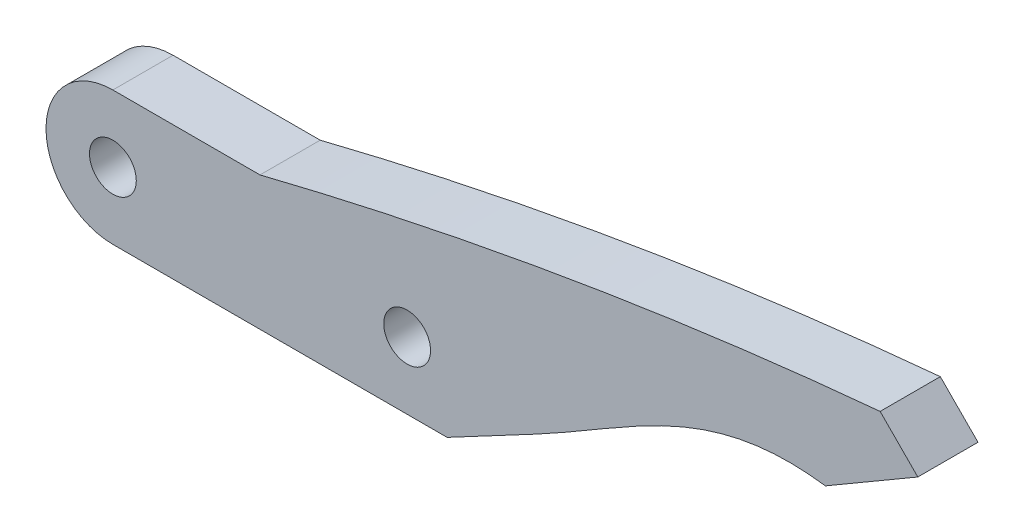
ISO-10303-21;
HEADER;
FILE_DESCRIPTION(('STEP AP214'),'2;1');
FILE_NAME('part.step','',(''),(''),'','','');
FILE_SCHEMA(('AUTOMOTIVE_DESIGN { 1 0 10303 214 1 1 1 1 }'));
ENDSEC;
DATA;
#1=APPLICATION_CONTEXT('core data for automotive mechanical design processes');
#2=APPLICATION_PROTOCOL_DEFINITION('international standard','automotive_design',2000,#1);
#3=PRODUCT_CONTEXT('',#1,'mechanical');
#4=PRODUCT('Part','Part','',(#3));
#5=PRODUCT_RELATED_PRODUCT_CATEGORY('part','',(#4));
#6=PRODUCT_DEFINITION_FORMATION('','',#4);
#7=PRODUCT_DEFINITION_CONTEXT('part definition',#1,'design');
#8=PRODUCT_DEFINITION('design','',#6,#7);
#9=PRODUCT_DEFINITION_SHAPE('','',#8);
#10=(LENGTH_UNIT() NAMED_UNIT(*) SI_UNIT(.MILLI.,.METRE.));
#11=(NAMED_UNIT(*) PLANE_ANGLE_UNIT() SI_UNIT($,.RADIAN.));
#12=(NAMED_UNIT(*) SI_UNIT($,.STERADIAN.) SOLID_ANGLE_UNIT());
#13=UNCERTAINTY_MEASURE_WITH_UNIT(LENGTH_MEASURE(1.E-05),#10,'distance_accuracy_value','');
#14=(GEOMETRIC_REPRESENTATION_CONTEXT(3) GLOBAL_UNCERTAINTY_ASSIGNED_CONTEXT((#13)) GLOBAL_UNIT_ASSIGNED_CONTEXT((#10,
#11,#12)) REPRESENTATION_CONTEXT('',''));
#15=CARTESIAN_POINT('',(0.,0.,0.));
#16=DIRECTION('',(0.,0.,1.));
#17=DIRECTION('',(1.,0.,0.));
#18=AXIS2_PLACEMENT_3D('',#15,#16,#17);
#19=CARTESIAN_POINT('',(0.,-5.,4.5));
#20=DIRECTION('',(0.,-1.,0.));
#21=DIRECTION('',(0.,0.,-1.));
#22=AXIS2_PLACEMENT_3D('',#19,#20,#21);
#23=PLANE('',#22);
#24=DIRECTION('',(-1.,0.,0.));
#25=VECTOR('',#24,1.);
#26=CARTESIAN_POINT('',(0.,-5.,0.));
#27=LINE('',#26,#25);
#28=CARTESIAN_POINT('',(13.99,-5.,0.));
#29=VERTEX_POINT('',#28);
#30=CARTESIAN_POINT('',(-11.,-5.,0.));
#31=VERTEX_POINT('',#30);
#32=EDGE_CURVE('E81',#29,#31,#27,.T.);
#33=ORIENTED_EDGE('',*,*,#32,.F.);
#34=DIRECTION('',(0.,0.,1.));
#35=VECTOR('',#34,1.);
#36=CARTESIAN_POINT('',(13.99,-5.,-52.3267387246767));
#37=LINE('',#36,#35);
#38=CARTESIAN_POINT('',(13.99,-5.,4.5));
#39=VERTEX_POINT('',#38);
#40=EDGE_CURVE('E233',#29,#39,#37,.T.);
#41=ORIENTED_EDGE('',*,*,#40,.T.);
#42=DIRECTION('',(-1.,0.,0.));
#43=VECTOR('',#42,1.);
#44=CARTESIAN_POINT('',(0.,-5.,4.5));
#45=LINE('',#44,#43);
#46=CARTESIAN_POINT('',(-11.,-5.,4.5));
#47=VERTEX_POINT('',#46);
#48=EDGE_CURVE('E83',#39,#47,#45,.T.);
#49=ORIENTED_EDGE('',*,*,#48,.T.);
#50=DIRECTION('',(0.,0.,-1.));
#51=VECTOR('',#50,1.);
#52=CARTESIAN_POINT('',(-11.,-5.,4.5));
#53=LINE('',#52,#51);
#54=EDGE_CURVE('E50',#47,#31,#53,.T.);
#55=ORIENTED_EDGE('',*,*,#54,.T.);
#56=EDGE_LOOP('',(#33,#41,#49,#55));
#57=FACE_BOUND('',#56,.T.);
#58=ADVANCED_FACE('F43',(#57),#23,.T.);
#59=CARTESIAN_POINT('',(0.,5.,4.5));
#60=DIRECTION('',(0.,-1.,0.));
#61=DIRECTION('',(0.,0.,-1.));
#62=AXIS2_PLACEMENT_3D('',#59,#60,#61);
#63=PLANE('',#62);
#64=DIRECTION('',(-1.,0.,0.));
#65=VECTOR('',#64,1.);
#66=CARTESIAN_POINT('',(0.,5.,4.5));
#67=LINE('',#66,#65);
#68=CARTESIAN_POINT('',(0.,5.,4.5));
#69=VERTEX_POINT('',#68);
#70=CARTESIAN_POINT('',(-11.,5.,4.5));
#71=VERTEX_POINT('',#70);
#72=EDGE_CURVE('E57',#69,#71,#67,.T.);
#73=ORIENTED_EDGE('',*,*,#72,.F.);
#74=DIRECTION('',(0.,0.,1.));
#75=VECTOR('',#74,1.);
#76=CARTESIAN_POINT('',(0.,5.,-52.3267387246767));
#77=LINE('',#76,#75);
#78=CARTESIAN_POINT('',(0.,5.,0.));
#79=VERTEX_POINT('',#78);
#80=EDGE_CURVE('E118',#79,#69,#77,.T.);
#81=ORIENTED_EDGE('',*,*,#80,.F.);
#82=DIRECTION('',(-1.,0.,0.));
#83=VECTOR('',#82,1.);
#84=CARTESIAN_POINT('',(0.,5.,0.));
#85=LINE('',#84,#83);
#86=CARTESIAN_POINT('',(-11.,5.,0.));
#87=VERTEX_POINT('',#86);
#88=EDGE_CURVE('E92',#79,#87,#85,.T.);
#89=ORIENTED_EDGE('',*,*,#88,.T.);
#90=DIRECTION('',(0.,0.,-1.));
#91=VECTOR('',#90,1.);
#92=CARTESIAN_POINT('',(-11.,5.,4.5));
#93=LINE('',#92,#91);
#94=EDGE_CURVE('E11',#71,#87,#93,.T.);
#95=ORIENTED_EDGE('',*,*,#94,.F.);
#96=EDGE_LOOP('',(#73,#81,#89,#95));
#97=FACE_BOUND('',#96,.T.);
#98=ADVANCED_FACE('F143',(#97),#63,.F.);
#99=CARTESIAN_POINT('',(-11.,0.,4.5));
#100=DIRECTION('',(0.,0.,-1.));
#101=DIRECTION('',(-1.,0.,0.));
#102=AXIS2_PLACEMENT_3D('',#99,#100,#101);
#103=CYLINDRICAL_SURFACE('',#102,1.75);
#104=CARTESIAN_POINT('',(-11.,0.,4.5));
#105=DIRECTION('',(0.,0.,1.));
#106=DIRECTION('',(1.,0.,0.));
#107=AXIS2_PLACEMENT_3D('',#104,#105,#106);
#108=CIRCLE('',#107,1.75);
#109=CARTESIAN_POINT('',(-9.25,0.,4.5));
#110=VERTEX_POINT('',#109);
#111=EDGE_CURVE('E121',#110,#110,#108,.T.);
#112=ORIENTED_EDGE('',*,*,#111,.T.);
#113=EDGE_LOOP('',(#112));
#114=FACE_BOUND('',#113,.T.);
#115=CARTESIAN_POINT('',(-11.,0.,0.));
#116=DIRECTION('',(0.,0.,1.));
#117=DIRECTION('',(1.,0.,0.));
#118=AXIS2_PLACEMENT_3D('',#115,#116,#117);
#119=CIRCLE('',#118,1.75);
#120=CARTESIAN_POINT('',(-9.25,0.,0.));
#121=VERTEX_POINT('',#120);
#122=EDGE_CURVE('E91',#121,#121,#119,.T.);
#123=ORIENTED_EDGE('',*,*,#122,.F.);
#124=EDGE_LOOP('',(#123));
#125=FACE_BOUND('',#124,.T.);
#126=ADVANCED_FACE('F139',(#114,#125),#103,.F.);
#127=CARTESIAN_POINT('',(-11.,0.,4.5));
#128=DIRECTION('',(0.,0.,-1.));
#129=DIRECTION('',(-1.,0.,0.));
#130=AXIS2_PLACEMENT_3D('',#127,#128,#129);
#131=CYLINDRICAL_SURFACE('',#130,5.);
#132=CARTESIAN_POINT('',(-11.,0.,0.));
#133=DIRECTION('',(0.,0.,1.));
#134=DIRECTION('',(1.,0.,0.));
#135=AXIS2_PLACEMENT_3D('',#132,#133,#134);
#136=CIRCLE('',#135,5.);
#137=EDGE_CURVE('E87',#87,#31,#136,.T.);
#138=ORIENTED_EDGE('',*,*,#137,.T.);
#139=ORIENTED_EDGE('',*,*,#54,.F.);
#140=CARTESIAN_POINT('',(-11.,0.,4.5));
#141=DIRECTION('',(0.,0.,1.));
#142=DIRECTION('',(1.,0.,0.));
#143=AXIS2_PLACEMENT_3D('',#140,#141,#142);
#144=CIRCLE('',#143,5.);
#145=EDGE_CURVE('E65',#71,#47,#144,.T.);
#146=ORIENTED_EDGE('',*,*,#145,.F.);
#147=ORIENTED_EDGE('',*,*,#94,.T.);
#148=EDGE_LOOP('',(#138,#139,#146,#147));
#149=FACE_BOUND('',#148,.T.);
#150=ADVANCED_FACE('F88',(#149),#131,.T.);
#151=CARTESIAN_POINT('',(11.,0.,4.5));
#152=DIRECTION('',(0.,0.,-1.));
#153=DIRECTION('',(-1.,0.,0.));
#154=AXIS2_PLACEMENT_3D('',#151,#152,#153);
#155=CYLINDRICAL_SURFACE('',#154,1.75);
#156=CARTESIAN_POINT('',(11.,0.,4.5));
#157=DIRECTION('',(0.,0.,1.));
#158=DIRECTION('',(1.,0.,0.));
#159=AXIS2_PLACEMENT_3D('',#156,#157,#158);
#160=CIRCLE('',#159,1.75);
#161=CARTESIAN_POINT('',(12.75,0.,4.5));
#162=VERTEX_POINT('',#161);
#163=EDGE_CURVE('E85',#162,#162,#160,.F.);
#164=ORIENTED_EDGE('',*,*,#163,.F.);
#165=EDGE_LOOP('',(#164));
#166=FACE_BOUND('',#165,.T.);
#167=CARTESIAN_POINT('',(11.,0.,0.));
#168=DIRECTION('',(0.,0.,1.));
#169=DIRECTION('',(1.,0.,0.));
#170=AXIS2_PLACEMENT_3D('',#167,#168,#169);
#171=CIRCLE('',#170,1.75);
#172=CARTESIAN_POINT('',(12.75,0.,0.));
#173=VERTEX_POINT('',#172);
#174=EDGE_CURVE('E111',#173,#173,#171,.F.);
#175=ORIENTED_EDGE('',*,*,#174,.T.);
#176=EDGE_LOOP('',(#175));
#177=FACE_BOUND('',#176,.T.);
#178=ADVANCED_FACE('F130',(#166,#177),#155,.F.);
#179=CARTESIAN_POINT('',(0.,0.,4.5));
#180=DIRECTION('',(0.,0.,1.));
#181=DIRECTION('',(1.,0.,0.));
#182=AXIS2_PLACEMENT_3D('',#179,#180,#181);
#183=PLANE('',#182);
#184=ORIENTED_EDGE('',*,*,#48,.F.);
#185=DIRECTION('',(0.882942972945771,0.469480251475697,0.));
#186=VECTOR('',#185,1.);
#187=CARTESIAN_POINT('',(20.61,-1.48,4.5));
#188=LINE('',#187,#186);
#189=CARTESIAN_POINT('',(20.61,-1.48,4.5));
#190=VERTEX_POINT('',#189);
#191=EDGE_CURVE('E242',#39,#190,#188,.T.);
#192=ORIENTED_EDGE('',*,*,#191,.T.);
#193=CARTESIAN_POINT('',(20.61,-1.48,4.5));
#194=CARTESIAN_POINT('',(27.8015694056562,2.34391605859665,4.5));
#195=CARTESIAN_POINT('',(33.4578404264351,7.2136739043609,4.5));
#196=CARTESIAN_POINT('',(42.27,6.,4.5));
#197=B_SPLINE_CURVE_WITH_KNOTS('',3,(#193,#194,#195,#196),.UNSPECIFIED.,.F.,.F.,(4,4),(0.,1.),.UNSPECIFIED.);
#198=CARTESIAN_POINT('',(42.27,6.,4.5));
#199=VERTEX_POINT('',#198);
#200=EDGE_CURVE('E238',#190,#199,#197,.T.);
#201=ORIENTED_EDGE('',*,*,#200,.T.);
#202=DIRECTION('',(0.86384948775814,0.50375,0.));
#203=VECTOR('',#202,1.);
#204=CARTESIAN_POINT('',(49.1807959020651,10.03,4.5));
#205=LINE('',#204,#203);
#206=CARTESIAN_POINT('',(49.1807959020651,10.03,4.5));
#207=VERTEX_POINT('',#206);
#208=EDGE_CURVE('E236',#199,#207,#205,.T.);
#209=ORIENTED_EDGE('',*,*,#208,.T.);
#210=DIRECTION('',(-0.70420167565833,0.71,0.));
#211=VECTOR('',#210,1.);
#212=CARTESIAN_POINT('',(46.3639891994318,12.87,4.5));
#213=LINE('',#212,#211);
#214=CARTESIAN_POINT('',(46.3639891994318,12.87,4.5));
#215=VERTEX_POINT('',#214);
#216=EDGE_CURVE('E226',#207,#215,#213,.T.);
#217=ORIENTED_EDGE('',*,*,#216,.T.);
#218=CARTESIAN_POINT('',(46.3639891994318,12.87,4.5));
#219=CARTESIAN_POINT('',(22.8855175011126,10.7079266509718,4.5));
#220=CARTESIAN_POINT('',(0.,5.,4.5));
#221=B_SPLINE_CURVE_WITH_KNOTS('',2,(#218,#219,#220),.UNSPECIFIED.,.F.,.F.,(3,3),(0.,1.),.UNSPECIFIED.);
#222=EDGE_CURVE('E181',#215,#69,#221,.T.);
#223=ORIENTED_EDGE('',*,*,#222,.T.);
#224=ORIENTED_EDGE('',*,*,#72,.T.);
#225=ORIENTED_EDGE('',*,*,#145,.T.);
#226=EDGE_LOOP('',(#184,#192,#201,#209,#217,#223,#224,#225));
#227=FACE_BOUND('',#226,.T.);
#228=ORIENTED_EDGE('',*,*,#111,.F.);
#229=EDGE_LOOP('',(#228));
#230=FACE_BOUND('',#229,.T.);
#231=ORIENTED_EDGE('',*,*,#163,.T.);
#232=EDGE_LOOP('',(#231));
#233=FACE_BOUND('',#232,.T.);
#234=ADVANCED_FACE('F128',(#227,#230,#233),#183,.T.);
#235=CARTESIAN_POINT('',(0.,0.,0.));
#236=DIRECTION('',(0.,0.,1.));
#237=DIRECTION('',(1.,0.,0.));
#238=AXIS2_PLACEMENT_3D('',#235,#236,#237);
#239=PLANE('',#238);
#240=DIRECTION('',(-0.882942972945771,-0.469480251475697,0.));
#241=VECTOR('',#240,1.);
#242=CARTESIAN_POINT('',(20.61,-1.48,0.));
#243=LINE('',#242,#241);
#244=CARTESIAN_POINT('',(20.61,-1.48,0.));
#245=VERTEX_POINT('',#244);
#246=EDGE_CURVE('E98',#245,#29,#243,.T.);
#247=ORIENTED_EDGE('',*,*,#246,.T.);
#248=ORIENTED_EDGE('',*,*,#32,.T.);
#249=ORIENTED_EDGE('',*,*,#137,.F.);
#250=ORIENTED_EDGE('',*,*,#88,.F.);
#251=CARTESIAN_POINT('',(46.3639891994318,12.87,0.));
#252=CARTESIAN_POINT('',(22.8855175011126,10.7079266509718,0.));
#253=CARTESIAN_POINT('',(0.,5.,0.));
#254=B_SPLINE_CURVE_WITH_KNOTS('',2,(#251,#252,#253),.UNSPECIFIED.,.F.,.F.,(3,3),(0.,1.),.UNSPECIFIED.);
#255=CARTESIAN_POINT('',(46.3639891994318,12.87,0.));
#256=VERTEX_POINT('',#255);
#257=EDGE_CURVE('E100',#79,#256,#254,.F.);
#258=ORIENTED_EDGE('',*,*,#257,.T.);
#259=DIRECTION('',(0.70420167565833,-0.71,0.));
#260=VECTOR('',#259,1.);
#261=CARTESIAN_POINT('',(46.3639891994318,12.87,0.));
#262=LINE('',#261,#260);
#263=CARTESIAN_POINT('',(49.1807959020651,10.03,0.));
#264=VERTEX_POINT('',#263);
#265=EDGE_CURVE('E104',#256,#264,#262,.T.);
#266=ORIENTED_EDGE('',*,*,#265,.T.);
#267=DIRECTION('',(-0.86384948775814,-0.50375,0.));
#268=VECTOR('',#267,1.);
#269=CARTESIAN_POINT('',(49.1807959020651,10.03,0.));
#270=LINE('',#269,#268);
#271=CARTESIAN_POINT('',(42.27,6.,0.));
#272=VERTEX_POINT('',#271);
#273=EDGE_CURVE('E216',#264,#272,#270,.T.);
#274=ORIENTED_EDGE('',*,*,#273,.T.);
#275=CARTESIAN_POINT('',(20.61,-1.48,0.));
#276=CARTESIAN_POINT('',(27.8015694056562,2.34391605859665,0.));
#277=CARTESIAN_POINT('',(33.4578404264351,7.2136739043609,0.));
#278=CARTESIAN_POINT('',(42.27,6.,0.));
#279=B_SPLINE_CURVE_WITH_KNOTS('',3,(#275,#276,#277,#278),.UNSPECIFIED.,.F.,.F.,(4,4),(0.,1.),.UNSPECIFIED.);
#280=EDGE_CURVE('E221',#272,#245,#279,.F.);
#281=ORIENTED_EDGE('',*,*,#280,.T.);
#282=EDGE_LOOP('',(#247,#248,#249,#250,#258,#266,#274,#281));
#283=FACE_BOUND('',#282,.T.);
#284=ORIENTED_EDGE('',*,*,#122,.T.);
#285=EDGE_LOOP('',(#284));
#286=FACE_BOUND('',#285,.T.);
#287=ORIENTED_EDGE('',*,*,#174,.F.);
#288=EDGE_LOOP('',(#287));
#289=FACE_BOUND('',#288,.T.);
#290=ADVANCED_FACE('F94',(#283,#286,#289),#239,.F.);
#291=CARTESIAN_POINT('',(46.3639891994318,12.87,-52.3267387246767));
#292=CARTESIAN_POINT('',(22.8855175011126,10.7079266509718,-52.3267387246767));
#293=CARTESIAN_POINT('',(0.,5.,-52.3267387246767));
#294=B_SPLINE_CURVE_WITH_KNOTS('',2,(#291,#292,#293),.UNSPECIFIED.,.F.,.F.,(3,3),(0.,1.),.UNSPECIFIED.);
#295=DIRECTION('',(0.,0.,1.));
#296=VECTOR('',#295,1.);
#297=SURFACE_OF_LINEAR_EXTRUSION('',#294,#296);
#298=ORIENTED_EDGE('',*,*,#257,.F.);
#299=ORIENTED_EDGE('',*,*,#80,.T.);
#300=ORIENTED_EDGE('',*,*,#222,.F.);
#301=DIRECTION('',(0.,0.,1.));
#302=VECTOR('',#301,1.);
#303=CARTESIAN_POINT('',(46.3639891994318,12.87,-52.3267387246767));
#304=LINE('',#303,#302);
#305=EDGE_CURVE('E208',#256,#215,#304,.T.);
#306=ORIENTED_EDGE('',*,*,#305,.F.);
#307=EDGE_LOOP('',(#298,#299,#300,#306));
#308=FACE_BOUND('',#307,.T.);
#309=ADVANCED_FACE('F156',(#308),#297,.T.);
#310=CARTESIAN_POINT('',(46.3639891994318,12.87,-52.3267387246767));
#311=DIRECTION('',(0.71,0.70420167565833,0.));
#312=DIRECTION('',(-0.70420167565833,0.71,0.));
#313=AXIS2_PLACEMENT_3D('',#310,#311,#312);
#314=PLANE('',#313);
#315=ORIENTED_EDGE('',*,*,#265,.F.);
#316=ORIENTED_EDGE('',*,*,#305,.T.);
#317=ORIENTED_EDGE('',*,*,#216,.F.);
#318=DIRECTION('',(0.,0.,1.));
#319=VECTOR('',#318,1.);
#320=CARTESIAN_POINT('',(49.1807959020651,10.03,-52.3267387246767));
#321=LINE('',#320,#319);
#322=EDGE_CURVE('E212',#264,#207,#321,.T.);
#323=ORIENTED_EDGE('',*,*,#322,.F.);
#324=EDGE_LOOP('',(#315,#316,#317,#323));
#325=FACE_BOUND('',#324,.T.);
#326=ADVANCED_FACE('F160',(#325),#314,.T.);
#327=CARTESIAN_POINT('',(49.1807959020651,10.03,-52.3267387246767));
#328=DIRECTION('',(0.50375,-0.863849487758139,0.));
#329=DIRECTION('',(0.86384948775814,0.50375,0.));
#330=AXIS2_PLACEMENT_3D('',#327,#328,#329);
#331=PLANE('',#330);
#332=ORIENTED_EDGE('',*,*,#273,.F.);
#333=ORIENTED_EDGE('',*,*,#322,.T.);
#334=ORIENTED_EDGE('',*,*,#208,.F.);
#335=DIRECTION('',(0.,0.,1.));
#336=VECTOR('',#335,1.);
#337=CARTESIAN_POINT('',(42.27,6.,-52.3267387246767));
#338=LINE('',#337,#336);
#339=EDGE_CURVE('E223',#272,#199,#338,.T.);
#340=ORIENTED_EDGE('',*,*,#339,.F.);
#341=EDGE_LOOP('',(#332,#333,#334,#340));
#342=FACE_BOUND('',#341,.T.);
#343=ADVANCED_FACE('F191',(#342),#331,.T.);
#344=CARTESIAN_POINT('',(20.61,-1.48,-52.3267387246767));
#345=CARTESIAN_POINT('',(27.8015694056562,2.34391605859665,-52.3267387246767));
#346=CARTESIAN_POINT('',(33.4578404264351,7.2136739043609,-52.3267387246767));
#347=CARTESIAN_POINT('',(42.27,6.,-52.3267387246767));
#348=B_SPLINE_CURVE_WITH_KNOTS('',3,(#344,#345,#346,#347),.UNSPECIFIED.,.F.,.F.,(4,4),(0.,1.),.UNSPECIFIED.);
#349=DIRECTION('',(0.,0.,1.));
#350=VECTOR('',#349,1.);
#351=SURFACE_OF_LINEAR_EXTRUSION('',#348,#350);
#352=ORIENTED_EDGE('',*,*,#280,.F.);
#353=ORIENTED_EDGE('',*,*,#339,.T.);
#354=ORIENTED_EDGE('',*,*,#200,.F.);
#355=DIRECTION('',(0.,0.,1.));
#356=VECTOR('',#355,1.);
#357=CARTESIAN_POINT('',(20.61,-1.48,-52.3267387246767));
#358=LINE('',#357,#356);
#359=EDGE_CURVE('E231',#245,#190,#358,.T.);
#360=ORIENTED_EDGE('',*,*,#359,.F.);
#361=EDGE_LOOP('',(#352,#353,#354,#360));
#362=FACE_BOUND('',#361,.T.);
#363=ADVANCED_FACE('F188',(#362),#351,.T.);
#364=CARTESIAN_POINT('',(20.61,-1.48,-52.3267387246767));
#365=DIRECTION('',(0.469480251475697,-0.882942972945771,0.));
#366=DIRECTION('',(0.882942972945771,0.469480251475697,0.));
#367=AXIS2_PLACEMENT_3D('',#364,#365,#366);
#368=PLANE('',#367);
#369=ORIENTED_EDGE('',*,*,#246,.F.);
#370=ORIENTED_EDGE('',*,*,#359,.T.);
#371=ORIENTED_EDGE('',*,*,#191,.F.);
#372=ORIENTED_EDGE('',*,*,#40,.F.);
#373=EDGE_LOOP('',(#369,#370,#371,#372));
#374=FACE_BOUND('',#373,.T.);
#375=ADVANCED_FACE('F165',(#374),#368,.T.);
#376=CLOSED_SHELL('',(#58,#98,#126,#150,#178,#234,#290,#309,#326,#343,#363,#375));
#377=MANIFOLD_SOLID_BREP('B2',#376);
#378=ADVANCED_BREP_SHAPE_REPRESENTATION('',(#18,#377),#14);
#379=SHAPE_DEFINITION_REPRESENTATION(#9,#378);
ENDSEC;
END-ISO-10303-21;
